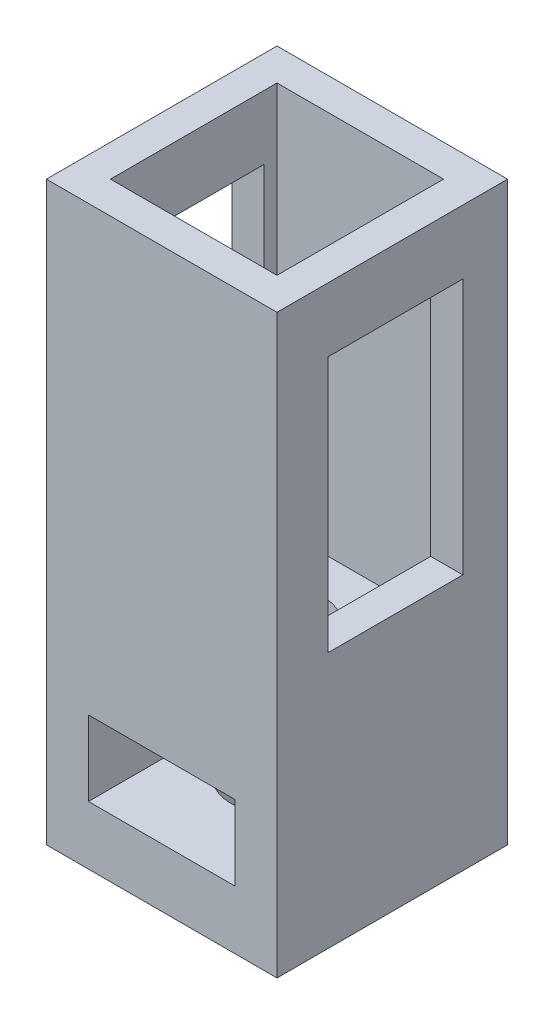
ISO-10303-21;
HEADER;
FILE_DESCRIPTION(('STEP AP214'),'2;1');
FILE_NAME('part.step','',(''),(''),'','','');
FILE_SCHEMA(('AUTOMOTIVE_DESIGN { 1 0 10303 214 1 1 1 1 }'));
ENDSEC;
DATA;
#1=APPLICATION_CONTEXT('core data for automotive mechanical design processes');
#2=APPLICATION_PROTOCOL_DEFINITION('international standard','automotive_design',2000,#1);
#3=PRODUCT_CONTEXT('',#1,'mechanical');
#4=PRODUCT('Part','Part','',(#3));
#5=PRODUCT_RELATED_PRODUCT_CATEGORY('part','',(#4));
#6=PRODUCT_DEFINITION_FORMATION('','',#4);
#7=PRODUCT_DEFINITION_CONTEXT('part definition',#1,'design');
#8=PRODUCT_DEFINITION('design','',#6,#7);
#9=PRODUCT_DEFINITION_SHAPE('','',#8);
#10=(LENGTH_UNIT() NAMED_UNIT(*) SI_UNIT(.MILLI.,.METRE.));
#11=(NAMED_UNIT(*) PLANE_ANGLE_UNIT() SI_UNIT($,.RADIAN.));
#12=(NAMED_UNIT(*) SI_UNIT($,.STERADIAN.) SOLID_ANGLE_UNIT());
#13=UNCERTAINTY_MEASURE_WITH_UNIT(LENGTH_MEASURE(1.E-05),#10,'distance_accuracy_value','');
#14=(GEOMETRIC_REPRESENTATION_CONTEXT(3) GLOBAL_UNCERTAINTY_ASSIGNED_CONTEXT((#13)) GLOBAL_UNIT_ASSIGNED_CONTEXT((#10,
#11,#12)) REPRESENTATION_CONTEXT('',''));
#15=CARTESIAN_POINT('',(0.,0.,0.));
#16=DIRECTION('',(0.,0.,1.));
#17=DIRECTION('',(1.,0.,0.));
#18=AXIS2_PLACEMENT_3D('',#15,#16,#17);
#19=CARTESIAN_POINT('',(0.,35.,0.));
#20=DIRECTION('',(1.,0.,0.));
#21=DIRECTION('',(0.,0.,-1.));
#22=AXIS2_PLACEMENT_3D('',#19,#20,#21);
#23=PLANE('',#22);
#24=DIRECTION('',(0.,0.,1.));
#25=VECTOR('',#24,1.);
#26=CARTESIAN_POINT('',(0.,30.,-4.));
#27=LINE('',#26,#25);
#28=CARTESIAN_POINT('',(0.,30.,-14.5));
#29=VERTEX_POINT('',#28);
#30=CARTESIAN_POINT('',(0.,30.,-4.));
#31=VERTEX_POINT('',#30);
#32=EDGE_CURVE('E234',#29,#31,#27,.T.);
#33=ORIENTED_EDGE('',*,*,#32,.T.);
#34=DIRECTION('',(0.,-1.,0.));
#35=VECTOR('',#34,1.);
#36=CARTESIAN_POINT('',(0.,30.,-4.));
#37=LINE('',#36,#35);
#38=CARTESIAN_POINT('',(0.,10.,-4.));
#39=VERTEX_POINT('',#38);
#40=EDGE_CURVE('E224',#31,#39,#37,.T.);
#41=ORIENTED_EDGE('',*,*,#40,.T.);
#42=DIRECTION('',(0.,0.,-1.));
#43=VECTOR('',#42,1.);
#44=CARTESIAN_POINT('',(0.,10.,-4.));
#45=LINE('',#44,#43);
#46=CARTESIAN_POINT('',(0.,10.,-14.5));
#47=VERTEX_POINT('',#46);
#48=EDGE_CURVE('E227',#39,#47,#45,.T.);
#49=ORIENTED_EDGE('',*,*,#48,.T.);
#50=DIRECTION('',(0.,1.,0.));
#51=VECTOR('',#50,1.);
#52=CARTESIAN_POINT('',(0.,30.,-14.5));
#53=LINE('',#52,#51);
#54=EDGE_CURVE('E231',#47,#29,#53,.T.);
#55=ORIENTED_EDGE('',*,*,#54,.T.);
#56=EDGE_LOOP('',(#33,#41,#49,#55));
#57=FACE_BOUND('',#56,.T.);
#58=DIRECTION('',(0.,-1.,0.));
#59=VECTOR('',#58,1.);
#60=CARTESIAN_POINT('',(0.,35.,-18.));
#61=LINE('',#60,#59);
#62=CARTESIAN_POINT('',(0.,35.,-18.));
#63=VERTEX_POINT('',#62);
#64=CARTESIAN_POINT('',(0.,-10.,-18.));
#65=VERTEX_POINT('',#64);
#66=EDGE_CURVE('E314',#63,#65,#61,.T.);
#67=ORIENTED_EDGE('',*,*,#66,.T.);
#68=DIRECTION('',(0.,0.,-1.));
#69=VECTOR('',#68,1.);
#70=CARTESIAN_POINT('',(0.,-10.,0.));
#71=LINE('',#70,#69);
#72=CARTESIAN_POINT('',(0.,-10.,0.));
#73=VERTEX_POINT('',#72);
#74=EDGE_CURVE('E208',#73,#65,#71,.T.);
#75=ORIENTED_EDGE('',*,*,#74,.F.);
#76=DIRECTION('',(0.,-1.,0.));
#77=VECTOR('',#76,1.);
#78=CARTESIAN_POINT('',(0.,35.,0.));
#79=LINE('',#78,#77);
#80=CARTESIAN_POINT('',(0.,35.,0.));
#81=VERTEX_POINT('',#80);
#82=EDGE_CURVE('E320',#81,#73,#79,.T.);
#83=ORIENTED_EDGE('',*,*,#82,.F.);
#84=DIRECTION('',(0.,0.,1.));
#85=VECTOR('',#84,1.);
#86=CARTESIAN_POINT('',(0.,35.,0.));
#87=LINE('',#86,#85);
#88=EDGE_CURVE('E299',#63,#81,#87,.T.);
#89=ORIENTED_EDGE('',*,*,#88,.F.);
#90=EDGE_LOOP('',(#67,#75,#83,#89));
#91=FACE_BOUND('',#90,.T.);
#92=ADVANCED_FACE('F35',(#57,#91),#23,.F.);
#93=CARTESIAN_POINT('',(0.,35.,0.));
#94=DIRECTION('',(0.,0.,-1.));
#95=DIRECTION('',(-1.,0.,0.));
#96=AXIS2_PLACEMENT_3D('',#93,#94,#95);
#97=PLANE('',#96);
#98=DIRECTION('',(1.,0.,0.));
#99=VECTOR('',#98,1.);
#100=CARTESIAN_POINT('',(3.285,-5.425,0.));
#101=LINE('',#100,#99);
#102=CARTESIAN_POINT('',(3.285,-5.425,0.));
#103=VERTEX_POINT('',#102);
#104=CARTESIAN_POINT('',(14.715,-5.425,0.));
#105=VERTEX_POINT('',#104);
#106=EDGE_CURVE('E202',#103,#105,#101,.T.);
#107=ORIENTED_EDGE('',*,*,#106,.F.);
#108=DIRECTION('',(0.,-1.,0.));
#109=VECTOR('',#108,1.);
#110=CARTESIAN_POINT('',(3.285,0.424999999999999,0.));
#111=LINE('',#110,#109);
#112=CARTESIAN_POINT('',(3.285,0.424999999999999,0.));
#113=VERTEX_POINT('',#112);
#114=EDGE_CURVE('E50',#113,#103,#111,.T.);
#115=ORIENTED_EDGE('',*,*,#114,.F.);
#116=DIRECTION('',(-1.,0.,0.));
#117=VECTOR('',#116,1.);
#118=CARTESIAN_POINT('',(3.285,0.424999999999999,0.));
#119=LINE('',#118,#117);
#120=CARTESIAN_POINT('',(14.715,0.424999999999999,0.));
#121=VERTEX_POINT('',#120);
#122=EDGE_CURVE('E190',#121,#113,#119,.T.);
#123=ORIENTED_EDGE('',*,*,#122,.F.);
#124=DIRECTION('',(0.,1.,0.));
#125=VECTOR('',#124,1.);
#126=CARTESIAN_POINT('',(14.715,0.424999999999999,0.));
#127=LINE('',#126,#125);
#128=EDGE_CURVE('E193',#105,#121,#127,.T.);
#129=ORIENTED_EDGE('',*,*,#128,.F.);
#130=EDGE_LOOP('',(#107,#115,#123,#129));
#131=FACE_BOUND('',#130,.T.);
#132=ORIENTED_EDGE('',*,*,#82,.T.);
#133=DIRECTION('',(-1.,0.,0.));
#134=VECTOR('',#133,1.);
#135=CARTESIAN_POINT('',(0.,-10.,0.));
#136=LINE('',#135,#134);
#137=CARTESIAN_POINT('',(18.,-10.,0.));
#138=VERTEX_POINT('',#137);
#139=EDGE_CURVE('E220',#138,#73,#136,.T.);
#140=ORIENTED_EDGE('',*,*,#139,.F.);
#141=DIRECTION('',(0.,-1.,0.));
#142=VECTOR('',#141,1.);
#143=CARTESIAN_POINT('',(18.,35.,0.));
#144=LINE('',#143,#142);
#145=CARTESIAN_POINT('',(18.,35.,0.));
#146=VERTEX_POINT('',#145);
#147=EDGE_CURVE('E318',#146,#138,#144,.T.);
#148=ORIENTED_EDGE('',*,*,#147,.F.);
#149=DIRECTION('',(1.,0.,0.));
#150=VECTOR('',#149,1.);
#151=CARTESIAN_POINT('',(0.,35.,0.));
#152=LINE('',#151,#150);
#153=EDGE_CURVE('E308',#81,#146,#152,.T.);
#154=ORIENTED_EDGE('',*,*,#153,.F.);
#155=EDGE_LOOP('',(#132,#140,#148,#154));
#156=FACE_BOUND('',#155,.T.);
#157=ADVANCED_FACE('F371',(#131,#156),#97,.F.);
#158=CARTESIAN_POINT('',(18.,35.,0.));
#159=DIRECTION('',(-1.,0.,0.));
#160=DIRECTION('',(0.,0.,1.));
#161=AXIS2_PLACEMENT_3D('',#158,#159,#160);
#162=PLANE('',#161);
#163=DIRECTION('',(0.,0.,-1.));
#164=VECTOR('',#163,1.);
#165=CARTESIAN_POINT('',(18.,10.,-4.));
#166=LINE('',#165,#164);
#167=CARTESIAN_POINT('',(18.,10.,-4.));
#168=VERTEX_POINT('',#167);
#169=CARTESIAN_POINT('',(18.,10.,-14.5));
#170=VERTEX_POINT('',#169);
#171=EDGE_CURVE('E239',#168,#170,#166,.T.);
#172=ORIENTED_EDGE('',*,*,#171,.F.);
#173=DIRECTION('',(0.,-1.,0.));
#174=VECTOR('',#173,1.);
#175=CARTESIAN_POINT('',(18.,30.,-4.));
#176=LINE('',#175,#174);
#177=CARTESIAN_POINT('',(18.,30.,-4.));
#178=VERTEX_POINT('',#177);
#179=EDGE_CURVE('E223',#178,#168,#176,.T.);
#180=ORIENTED_EDGE('',*,*,#179,.F.);
#181=DIRECTION('',(0.,0.,1.));
#182=VECTOR('',#181,1.);
#183=CARTESIAN_POINT('',(18.,30.,-4.));
#184=LINE('',#183,#182);
#185=CARTESIAN_POINT('',(18.,30.,-14.5));
#186=VERTEX_POINT('',#185);
#187=EDGE_CURVE('E228',#186,#178,#184,.T.);
#188=ORIENTED_EDGE('',*,*,#187,.F.);
#189=DIRECTION('',(0.,1.,0.));
#190=VECTOR('',#189,1.);
#191=CARTESIAN_POINT('',(18.,30.,-14.5));
#192=LINE('',#191,#190);
#193=EDGE_CURVE('E242',#170,#186,#192,.T.);
#194=ORIENTED_EDGE('',*,*,#193,.F.);
#195=EDGE_LOOP('',(#172,#180,#188,#194));
#196=FACE_BOUND('',#195,.T.);
#197=ORIENTED_EDGE('',*,*,#147,.T.);
#198=DIRECTION('',(0.,0.,1.));
#199=VECTOR('',#198,1.);
#200=CARTESIAN_POINT('',(18.,-10.,0.));
#201=LINE('',#200,#199);
#202=CARTESIAN_POINT('',(18.,-10.,-18.));
#203=VERTEX_POINT('',#202);
#204=EDGE_CURVE('E217',#203,#138,#201,.T.);
#205=ORIENTED_EDGE('',*,*,#204,.F.);
#206=DIRECTION('',(0.,-1.,0.));
#207=VECTOR('',#206,1.);
#208=CARTESIAN_POINT('',(18.,35.,-18.));
#209=LINE('',#208,#207);
#210=CARTESIAN_POINT('',(18.,35.,-18.));
#211=VERTEX_POINT('',#210);
#212=EDGE_CURVE('E316',#211,#203,#209,.T.);
#213=ORIENTED_EDGE('',*,*,#212,.F.);
#214=DIRECTION('',(0.,0.,-1.));
#215=VECTOR('',#214,1.);
#216=CARTESIAN_POINT('',(18.,35.,0.));
#217=LINE('',#216,#215);
#218=EDGE_CURVE('E310',#146,#211,#217,.T.);
#219=ORIENTED_EDGE('',*,*,#218,.F.);
#220=EDGE_LOOP('',(#197,#205,#213,#219));
#221=FACE_BOUND('',#220,.T.);
#222=ADVANCED_FACE('F344',(#196,#221),#162,.F.);
#223=CARTESIAN_POINT('',(0.,35.,-18.));
#224=DIRECTION('',(0.,0.,1.));
#225=DIRECTION('',(1.,0.,0.));
#226=AXIS2_PLACEMENT_3D('',#223,#224,#225);
#227=PLANE('',#226);
#228=DIRECTION('',(-1.,0.,0.));
#229=VECTOR('',#228,1.);
#230=CARTESIAN_POINT('',(3.285,0.424999999999999,-18.));
#231=LINE('',#230,#229);
#232=CARTESIAN_POINT('',(14.715,0.424999999999999,-18.));
#233=VERTEX_POINT('',#232);
#234=CARTESIAN_POINT('',(3.285,0.424999999999999,-18.));
#235=VERTEX_POINT('',#234);
#236=EDGE_CURVE('E180',#233,#235,#231,.T.);
#237=ORIENTED_EDGE('',*,*,#236,.T.);
#238=DIRECTION('',(0.,-1.,0.));
#239=VECTOR('',#238,1.);
#240=CARTESIAN_POINT('',(3.285,0.424999999999999,-18.));
#241=LINE('',#240,#239);
#242=CARTESIAN_POINT('',(3.285,-5.425,-18.));
#243=VERTEX_POINT('',#242);
#244=EDGE_CURVE('E174',#235,#243,#241,.T.);
#245=ORIENTED_EDGE('',*,*,#244,.T.);
#246=DIRECTION('',(1.,0.,0.));
#247=VECTOR('',#246,1.);
#248=CARTESIAN_POINT('',(3.285,-5.425,-18.));
#249=LINE('',#248,#247);
#250=CARTESIAN_POINT('',(14.715,-5.425,-18.));
#251=VERTEX_POINT('',#250);
#252=EDGE_CURVE('E183',#243,#251,#249,.T.);
#253=ORIENTED_EDGE('',*,*,#252,.T.);
#254=DIRECTION('',(0.,1.,0.));
#255=VECTOR('',#254,1.);
#256=CARTESIAN_POINT('',(14.715,0.424999999999999,-18.));
#257=LINE('',#256,#255);
#258=EDGE_CURVE('E58',#251,#233,#257,.T.);
#259=ORIENTED_EDGE('',*,*,#258,.T.);
#260=EDGE_LOOP('',(#237,#245,#253,#259));
#261=FACE_BOUND('',#260,.T.);
#262=ORIENTED_EDGE('',*,*,#212,.T.);
#263=DIRECTION('',(1.,0.,0.));
#264=VECTOR('',#263,1.);
#265=CARTESIAN_POINT('',(0.,-10.,-18.));
#266=LINE('',#265,#264);
#267=EDGE_CURVE('E214',#65,#203,#266,.T.);
#268=ORIENTED_EDGE('',*,*,#267,.F.);
#269=ORIENTED_EDGE('',*,*,#66,.F.);
#270=DIRECTION('',(-1.,0.,0.));
#271=VECTOR('',#270,1.);
#272=CARTESIAN_POINT('',(0.,35.,-18.));
#273=LINE('',#272,#271);
#274=EDGE_CURVE('E312',#211,#63,#273,.T.);
#275=ORIENTED_EDGE('',*,*,#274,.F.);
#276=EDGE_LOOP('',(#262,#268,#269,#275));
#277=FACE_BOUND('',#276,.T.);
#278=ADVANCED_FACE('F187',(#261,#277),#227,.F.);
#279=CARTESIAN_POINT('',(0.,35.,0.));
#280=DIRECTION('',(0.,-1.,0.));
#281=DIRECTION('',(0.,0.,-1.));
#282=AXIS2_PLACEMENT_3D('',#279,#280,#281);
#283=PLANE('',#282);
#284=DIRECTION('',(1.,0.,0.));
#285=VECTOR('',#284,1.);
#286=CARTESIAN_POINT('',(2.5,35.,-2.5));
#287=LINE('',#286,#285);
#288=CARTESIAN_POINT('',(2.5,35.,-2.5));
#289=VERTEX_POINT('',#288);
#290=CARTESIAN_POINT('',(15.5,35.,-2.5));
#291=VERTEX_POINT('',#290);
#292=EDGE_CURVE('E289',#289,#291,#287,.T.);
#293=ORIENTED_EDGE('',*,*,#292,.F.);
#294=DIRECTION('',(0.,0.,1.));
#295=VECTOR('',#294,1.);
#296=CARTESIAN_POINT('',(2.5,35.,-15.5));
#297=LINE('',#296,#295);
#298=CARTESIAN_POINT('',(2.5,35.,-15.5));
#299=VERTEX_POINT('',#298);
#300=EDGE_CURVE('E273',#299,#289,#297,.T.);
#301=ORIENTED_EDGE('',*,*,#300,.F.);
#302=DIRECTION('',(-1.,0.,0.));
#303=VECTOR('',#302,1.);
#304=CARTESIAN_POINT('',(2.5,35.,-15.5));
#305=LINE('',#304,#303);
#306=CARTESIAN_POINT('',(15.5,35.,-15.5));
#307=VERTEX_POINT('',#306);
#308=EDGE_CURVE('E278',#307,#299,#305,.T.);
#309=ORIENTED_EDGE('',*,*,#308,.F.);
#310=DIRECTION('',(0.,0.,-1.));
#311=VECTOR('',#310,1.);
#312=CARTESIAN_POINT('',(15.5,35.,-15.5));
#313=LINE('',#312,#311);
#314=EDGE_CURVE('E292',#291,#307,#313,.T.);
#315=ORIENTED_EDGE('',*,*,#314,.F.);
#316=EDGE_LOOP('',(#293,#301,#309,#315));
#317=FACE_BOUND('',#316,.T.);
#318=ORIENTED_EDGE('',*,*,#88,.T.);
#319=ORIENTED_EDGE('',*,*,#153,.T.);
#320=ORIENTED_EDGE('',*,*,#218,.T.);
#321=ORIENTED_EDGE('',*,*,#274,.T.);
#322=EDGE_LOOP('',(#318,#319,#320,#321));
#323=FACE_BOUND('',#322,.T.);
#324=ADVANCED_FACE('F393',(#317,#323),#283,.F.);
#325=CARTESIAN_POINT('',(2.5,5.,-15.5));
#326=DIRECTION('',(-1.,0.,0.));
#327=DIRECTION('',(0.,0.,1.));
#328=AXIS2_PLACEMENT_3D('',#325,#326,#327);
#329=PLANE('',#328);
#330=DIRECTION('',(0.,0.,1.));
#331=VECTOR('',#330,1.);
#332=CARTESIAN_POINT('',(2.5,10.,-15.5));
#333=LINE('',#332,#331);
#334=CARTESIAN_POINT('',(2.5,10.,-14.5));
#335=VERTEX_POINT('',#334);
#336=CARTESIAN_POINT('',(2.5,10.,-4.));
#337=VERTEX_POINT('',#336);
#338=EDGE_CURVE('E250',#335,#337,#333,.T.);
#339=ORIENTED_EDGE('',*,*,#338,.T.);
#340=DIRECTION('',(0.,1.,0.));
#341=VECTOR('',#340,1.);
#342=CARTESIAN_POINT('',(2.5,5.,-4.));
#343=LINE('',#342,#341);
#344=CARTESIAN_POINT('',(2.5,30.,-4.));
#345=VERTEX_POINT('',#344);
#346=EDGE_CURVE('E270',#337,#345,#343,.T.);
#347=ORIENTED_EDGE('',*,*,#346,.T.);
#348=DIRECTION('',(0.,0.,-1.));
#349=VECTOR('',#348,1.);
#350=CARTESIAN_POINT('',(2.5,30.,-15.5));
#351=LINE('',#350,#349);
#352=CARTESIAN_POINT('',(2.5,30.,-14.5));
#353=VERTEX_POINT('',#352);
#354=EDGE_CURVE('E267',#345,#353,#351,.T.);
#355=ORIENTED_EDGE('',*,*,#354,.T.);
#356=DIRECTION('',(0.,-1.,0.));
#357=VECTOR('',#356,1.);
#358=CARTESIAN_POINT('',(2.5,5.,-14.5));
#359=LINE('',#358,#357);
#360=EDGE_CURVE('E264',#353,#335,#359,.T.);
#361=ORIENTED_EDGE('',*,*,#360,.T.);
#362=EDGE_LOOP('',(#339,#347,#355,#361));
#363=FACE_BOUND('',#362,.T.);
#364=ORIENTED_EDGE('',*,*,#300,.T.);
#365=DIRECTION('',(0.,1.,0.));
#366=VECTOR('',#365,1.);
#367=CARTESIAN_POINT('',(2.5,5.,-2.5));
#368=LINE('',#367,#366);
#369=CARTESIAN_POINT('',(2.5,5.,-2.5));
#370=VERTEX_POINT('',#369);
#371=EDGE_CURVE('E287',#370,#289,#368,.T.);
#372=ORIENTED_EDGE('',*,*,#371,.F.);
#373=DIRECTION('',(0.,0.,1.));
#374=VECTOR('',#373,1.);
#375=CARTESIAN_POINT('',(2.5,5.,-15.5));
#376=LINE('',#375,#374);
#377=CARTESIAN_POINT('',(2.5,5.,-15.5));
#378=VERTEX_POINT('',#377);
#379=EDGE_CURVE('E274',#378,#370,#376,.T.);
#380=ORIENTED_EDGE('',*,*,#379,.F.);
#381=DIRECTION('',(0.,1.,0.));
#382=VECTOR('',#381,1.);
#383=CARTESIAN_POINT('',(2.5,5.,-15.5));
#384=LINE('',#383,#382);
#385=EDGE_CURVE('E297',#378,#299,#384,.T.);
#386=ORIENTED_EDGE('',*,*,#385,.T.);
#387=EDGE_LOOP('',(#364,#372,#380,#386));
#388=FACE_BOUND('',#387,.T.);
#389=ADVANCED_FACE('F403',(#363,#388),#329,.F.);
#390=CARTESIAN_POINT('',(2.5,5.,-15.5));
#391=DIRECTION('',(0.,0.,-1.));
#392=DIRECTION('',(-1.,0.,0.));
#393=AXIS2_PLACEMENT_3D('',#390,#391,#392);
#394=PLANE('',#393);
#395=ORIENTED_EDGE('',*,*,#308,.T.);
#396=ORIENTED_EDGE('',*,*,#385,.F.);
#397=DIRECTION('',(-1.,0.,0.));
#398=VECTOR('',#397,1.);
#399=CARTESIAN_POINT('',(2.5,5.,-15.5));
#400=LINE('',#399,#398);
#401=CARTESIAN_POINT('',(15.5,5.,-15.5));
#402=VERTEX_POINT('',#401);
#403=EDGE_CURVE('E284',#402,#378,#400,.T.);
#404=ORIENTED_EDGE('',*,*,#403,.F.);
#405=DIRECTION('',(0.,1.,0.));
#406=VECTOR('',#405,1.);
#407=CARTESIAN_POINT('',(15.5,5.,-15.5));
#408=LINE('',#407,#406);
#409=EDGE_CURVE('E300',#402,#307,#408,.T.);
#410=ORIENTED_EDGE('',*,*,#409,.T.);
#411=EDGE_LOOP('',(#395,#396,#404,#410));
#412=FACE_BOUND('',#411,.T.);
#413=ADVANCED_FACE('F407',(#412),#394,.F.);
#414=CARTESIAN_POINT('',(15.5,5.,-15.5));
#415=DIRECTION('',(1.,0.,0.));
#416=DIRECTION('',(0.,0.,-1.));
#417=AXIS2_PLACEMENT_3D('',#414,#415,#416);
#418=PLANE('',#417);
#419=DIRECTION('',(0.,0.,1.));
#420=VECTOR('',#419,1.);
#421=CARTESIAN_POINT('',(15.5,30.,-15.5));
#422=LINE('',#421,#420);
#423=CARTESIAN_POINT('',(15.5,30.,-14.5));
#424=VERTEX_POINT('',#423);
#425=CARTESIAN_POINT('',(15.5,30.,-4.));
#426=VERTEX_POINT('',#425);
#427=EDGE_CURVE('E43',#424,#426,#422,.T.);
#428=ORIENTED_EDGE('',*,*,#427,.T.);
#429=DIRECTION('',(0.,-1.,0.));
#430=VECTOR('',#429,1.);
#431=CARTESIAN_POINT('',(15.5,5.,-4.));
#432=LINE('',#431,#430);
#433=CARTESIAN_POINT('',(15.5,10.,-4.));
#434=VERTEX_POINT('',#433);
#435=EDGE_CURVE('E11',#426,#434,#432,.T.);
#436=ORIENTED_EDGE('',*,*,#435,.T.);
#437=DIRECTION('',(0.,0.,-1.));
#438=VECTOR('',#437,1.);
#439=CARTESIAN_POINT('',(15.5,10.,-15.5));
#440=LINE('',#439,#438);
#441=CARTESIAN_POINT('',(15.5,10.,-14.5));
#442=VERTEX_POINT('',#441);
#443=EDGE_CURVE('E322',#434,#442,#440,.T.);
#444=ORIENTED_EDGE('',*,*,#443,.T.);
#445=DIRECTION('',(0.,1.,0.));
#446=VECTOR('',#445,1.);
#447=CARTESIAN_POINT('',(15.5,5.,-14.5));
#448=LINE('',#447,#446);
#449=EDGE_CURVE('E325',#442,#424,#448,.T.);
#450=ORIENTED_EDGE('',*,*,#449,.T.);
#451=EDGE_LOOP('',(#428,#436,#444,#450));
#452=FACE_BOUND('',#451,.T.);
#453=ORIENTED_EDGE('',*,*,#314,.T.);
#454=ORIENTED_EDGE('',*,*,#409,.F.);
#455=DIRECTION('',(0.,0.,-1.));
#456=VECTOR('',#455,1.);
#457=CARTESIAN_POINT('',(15.5,5.,-15.5));
#458=LINE('',#457,#456);
#459=CARTESIAN_POINT('',(15.5,5.,-2.5));
#460=VERTEX_POINT('',#459);
#461=EDGE_CURVE('E281',#460,#402,#458,.T.);
#462=ORIENTED_EDGE('',*,*,#461,.F.);
#463=DIRECTION('',(0.,1.,0.));
#464=VECTOR('',#463,1.);
#465=CARTESIAN_POINT('',(15.5,5.,-2.5));
#466=LINE('',#465,#464);
#467=EDGE_CURVE('E302',#460,#291,#466,.T.);
#468=ORIENTED_EDGE('',*,*,#467,.T.);
#469=EDGE_LOOP('',(#453,#454,#462,#468));
#470=FACE_BOUND('',#469,.T.);
#471=ADVANCED_FACE('F330',(#452,#470),#418,.F.);
#472=CARTESIAN_POINT('',(2.5,5.,-2.5));
#473=DIRECTION('',(0.,0.,1.));
#474=DIRECTION('',(1.,0.,0.));
#475=AXIS2_PLACEMENT_3D('',#472,#473,#474);
#476=PLANE('',#475);
#477=ORIENTED_EDGE('',*,*,#292,.T.);
#478=ORIENTED_EDGE('',*,*,#467,.F.);
#479=DIRECTION('',(1.,0.,0.));
#480=VECTOR('',#479,1.);
#481=CARTESIAN_POINT('',(2.5,5.,-2.5));
#482=LINE('',#481,#480);
#483=EDGE_CURVE('E277',#370,#460,#482,.T.);
#484=ORIENTED_EDGE('',*,*,#483,.F.);
#485=ORIENTED_EDGE('',*,*,#371,.T.);
#486=EDGE_LOOP('',(#477,#478,#484,#485));
#487=FACE_BOUND('',#486,.T.);
#488=ADVANCED_FACE('F363',(#487),#476,.F.);
#489=CARTESIAN_POINT('',(0.,5.,0.));
#490=DIRECTION('',(0.,1.,0.));
#491=DIRECTION('',(0.,0.,1.));
#492=AXIS2_PLACEMENT_3D('',#489,#490,#491);
#493=PLANE('',#492);
#494=CARTESIAN_POINT('',(9.,5.,-9.));
#495=DIRECTION('',(0.,-1.,0.));
#496=DIRECTION('',(0.,0.,-1.));
#497=AXIS2_PLACEMENT_3D('',#494,#495,#496);
#498=CIRCLE('',#497,3.57123999999999);
#499=CARTESIAN_POINT('',(9.,5.,-12.57124));
#500=VERTEX_POINT('',#499);
#501=EDGE_CURVE('E472',#500,#500,#498,.T.);
#502=ORIENTED_EDGE('',*,*,#501,.T.);
#503=EDGE_LOOP('',(#502));
#504=FACE_BOUND('',#503,.T.);
#505=ORIENTED_EDGE('',*,*,#379,.T.);
#506=ORIENTED_EDGE('',*,*,#483,.T.);
#507=ORIENTED_EDGE('',*,*,#461,.T.);
#508=ORIENTED_EDGE('',*,*,#403,.T.);
#509=EDGE_LOOP('',(#505,#506,#507,#508));
#510=FACE_BOUND('',#509,.T.);
#511=ADVANCED_FACE('F353',(#504,#510),#493,.T.);
#512=CARTESIAN_POINT('',(0.,10.,-4.));
#513=DIRECTION('',(0.,-1.,0.));
#514=DIRECTION('',(0.,0.,-1.));
#515=AXIS2_PLACEMENT_3D('',#512,#513,#514);
#516=PLANE('',#515);
#517=DIRECTION('',(1.,0.,0.));
#518=VECTOR('',#517,1.);
#519=CARTESIAN_POINT('',(0.,10.,-4.));
#520=LINE('',#519,#518);
#521=EDGE_CURVE('E237',#434,#168,#520,.T.);
#522=ORIENTED_EDGE('',*,*,#521,.T.);
#523=ORIENTED_EDGE('',*,*,#171,.T.);
#524=DIRECTION('',(1.,0.,0.));
#525=VECTOR('',#524,1.);
#526=CARTESIAN_POINT('',(0.,10.,-14.5));
#527=LINE('',#526,#525);
#528=EDGE_CURVE('E259',#442,#170,#527,.T.);
#529=ORIENTED_EDGE('',*,*,#528,.F.);
#530=ORIENTED_EDGE('',*,*,#443,.F.);
#531=EDGE_LOOP('',(#522,#523,#529,#530));
#532=FACE_BOUND('',#531,.T.);
#533=ADVANCED_FACE('F351',(#532),#516,.F.);
#534=CARTESIAN_POINT('',(0.,30.,-14.5));
#535=DIRECTION('',(0.,0.,-1.));
#536=DIRECTION('',(-1.,0.,0.));
#537=AXIS2_PLACEMENT_3D('',#534,#535,#536);
#538=PLANE('',#537);
#539=ORIENTED_EDGE('',*,*,#528,.T.);
#540=ORIENTED_EDGE('',*,*,#193,.T.);
#541=DIRECTION('',(1.,0.,0.));
#542=VECTOR('',#541,1.);
#543=CARTESIAN_POINT('',(0.,30.,-14.5));
#544=LINE('',#543,#542);
#545=EDGE_CURVE('E255',#424,#186,#544,.T.);
#546=ORIENTED_EDGE('',*,*,#545,.F.);
#547=ORIENTED_EDGE('',*,*,#449,.F.);
#548=EDGE_LOOP('',(#539,#540,#546,#547));
#549=FACE_BOUND('',#548,.T.);
#550=ADVANCED_FACE('F338',(#549),#538,.F.);
#551=CARTESIAN_POINT('',(0.,30.,-4.));
#552=DIRECTION('',(0.,1.,0.));
#553=DIRECTION('',(0.,0.,1.));
#554=AXIS2_PLACEMENT_3D('',#551,#552,#553);
#555=PLANE('',#554);
#556=ORIENTED_EDGE('',*,*,#545,.T.);
#557=ORIENTED_EDGE('',*,*,#187,.T.);
#558=DIRECTION('',(1.,0.,0.));
#559=VECTOR('',#558,1.);
#560=CARTESIAN_POINT('',(0.,30.,-4.));
#561=LINE('',#560,#559);
#562=EDGE_CURVE('E251',#426,#178,#561,.T.);
#563=ORIENTED_EDGE('',*,*,#562,.F.);
#564=ORIENTED_EDGE('',*,*,#427,.F.);
#565=EDGE_LOOP('',(#556,#557,#563,#564));
#566=FACE_BOUND('',#565,.T.);
#567=ADVANCED_FACE('F336',(#566),#555,.F.);
#568=CARTESIAN_POINT('',(0.,30.,-4.));
#569=DIRECTION('',(0.,0.,1.));
#570=DIRECTION('',(1.,0.,0.));
#571=AXIS2_PLACEMENT_3D('',#568,#569,#570);
#572=PLANE('',#571);
#573=ORIENTED_EDGE('',*,*,#562,.T.);
#574=ORIENTED_EDGE('',*,*,#179,.T.);
#575=ORIENTED_EDGE('',*,*,#521,.F.);
#576=ORIENTED_EDGE('',*,*,#435,.F.);
#577=EDGE_LOOP('',(#573,#574,#575,#576));
#578=FACE_BOUND('',#577,.T.);
#579=ADVANCED_FACE('F349',(#578),#572,.F.);
#580=EDGE_CURVE('E260',#39,#337,#520,.T.);
#581=ORIENTED_EDGE('',*,*,#580,.F.);
#582=ORIENTED_EDGE('',*,*,#40,.F.);
#583=EDGE_CURVE('E247',#31,#345,#561,.T.);
#584=ORIENTED_EDGE('',*,*,#583,.T.);
#585=ORIENTED_EDGE('',*,*,#346,.F.);
#586=EDGE_LOOP('',(#581,#582,#584,#585));
#587=FACE_BOUND('',#586,.T.);
#588=ADVANCED_FACE('F416',(#587),#572,.F.);
#589=ORIENTED_EDGE('',*,*,#583,.F.);
#590=ORIENTED_EDGE('',*,*,#32,.F.);
#591=EDGE_CURVE('E252',#29,#353,#544,.T.);
#592=ORIENTED_EDGE('',*,*,#591,.T.);
#593=ORIENTED_EDGE('',*,*,#354,.F.);
#594=EDGE_LOOP('',(#589,#590,#592,#593));
#595=FACE_BOUND('',#594,.T.);
#596=ADVANCED_FACE('F418',(#595),#555,.F.);
#597=ORIENTED_EDGE('',*,*,#591,.F.);
#598=ORIENTED_EDGE('',*,*,#54,.F.);
#599=EDGE_CURVE('E256',#47,#335,#527,.T.);
#600=ORIENTED_EDGE('',*,*,#599,.T.);
#601=ORIENTED_EDGE('',*,*,#360,.F.);
#602=EDGE_LOOP('',(#597,#598,#600,#601));
#603=FACE_BOUND('',#602,.T.);
#604=ADVANCED_FACE('F361',(#603),#538,.F.);
#605=ORIENTED_EDGE('',*,*,#599,.F.);
#606=ORIENTED_EDGE('',*,*,#48,.F.);
#607=ORIENTED_EDGE('',*,*,#580,.T.);
#608=ORIENTED_EDGE('',*,*,#338,.F.);
#609=EDGE_LOOP('',(#605,#606,#607,#608));
#610=FACE_BOUND('',#609,.T.);
#611=ADVANCED_FACE('F355',(#610),#516,.F.);
#612=CARTESIAN_POINT('',(0.,-10.,0.));
#613=DIRECTION('',(0.,-1.,0.));
#614=DIRECTION('',(0.,0.,-1.));
#615=AXIS2_PLACEMENT_3D('',#612,#613,#614);
#616=PLANE('',#615);
#617=CARTESIAN_POINT('',(9.,-10.,-9.));
#618=DIRECTION('',(0.,-1.,0.));
#619=DIRECTION('',(0.,0.,-1.));
#620=AXIS2_PLACEMENT_3D('',#617,#618,#619);
#621=CIRCLE('',#620,3.57124);
#622=CARTESIAN_POINT('',(9.,-10.,-12.57124));
#623=VERTEX_POINT('',#622);
#624=EDGE_CURVE('E477',#623,#623,#621,.T.);
#625=ORIENTED_EDGE('',*,*,#624,.F.);
#626=EDGE_LOOP('',(#625));
#627=FACE_BOUND('',#626,.T.);
#628=ORIENTED_EDGE('',*,*,#74,.T.);
#629=ORIENTED_EDGE('',*,*,#267,.T.);
#630=ORIENTED_EDGE('',*,*,#204,.T.);
#631=ORIENTED_EDGE('',*,*,#139,.T.);
#632=EDGE_LOOP('',(#628,#629,#630,#631));
#633=FACE_BOUND('',#632,.T.);
#634=ADVANCED_FACE('F368',(#627,#633),#616,.T.);
#635=CARTESIAN_POINT('',(3.285,0.424999999999999,-18.));
#636=DIRECTION('',(-1.,0.,0.));
#637=DIRECTION('',(0.,-1.,0.));
#638=AXIS2_PLACEMENT_3D('',#635,#636,#637);
#639=PLANE('',#638);
#640=ORIENTED_EDGE('',*,*,#114,.T.);
#641=DIRECTION('',(0.,0.,1.));
#642=VECTOR('',#641,1.);
#643=CARTESIAN_POINT('',(3.285,-5.425,-18.));
#644=LINE('',#643,#642);
#645=EDGE_CURVE('E170',#243,#103,#644,.T.);
#646=ORIENTED_EDGE('',*,*,#645,.F.);
#647=ORIENTED_EDGE('',*,*,#244,.F.);
#648=DIRECTION('',(0.,0.,1.));
#649=VECTOR('',#648,1.);
#650=CARTESIAN_POINT('',(3.285,0.424999999999999,-18.));
#651=LINE('',#650,#649);
#652=EDGE_CURVE('E206',#235,#113,#651,.T.);
#653=ORIENTED_EDGE('',*,*,#652,.T.);
#654=EDGE_LOOP('',(#640,#646,#647,#653));
#655=FACE_BOUND('',#654,.T.);
#656=ADVANCED_FACE('F172',(#655),#639,.F.);
#657=CARTESIAN_POINT('',(3.285,0.424999999999999,-18.));
#658=DIRECTION('',(0.,1.,0.));
#659=DIRECTION('',(0.,0.,1.));
#660=AXIS2_PLACEMENT_3D('',#657,#658,#659);
#661=PLANE('',#660);
#662=CARTESIAN_POINT('',(9.,0.425,-9.));
#663=DIRECTION('',(0.,1.,0.));
#664=DIRECTION('',(0.,0.,1.));
#665=AXIS2_PLACEMENT_3D('',#662,#663,#664);
#666=CIRCLE('',#665,3.57124);
#667=CARTESIAN_POINT('',(9.,0.425,-5.42876));
#668=VERTEX_POINT('',#667);
#669=EDGE_CURVE('E196',#668,#668,#666,.T.);
#670=ORIENTED_EDGE('',*,*,#669,.T.);
#671=EDGE_LOOP('',(#670));
#672=FACE_BOUND('',#671,.T.);
#673=ORIENTED_EDGE('',*,*,#122,.T.);
#674=ORIENTED_EDGE('',*,*,#652,.F.);
#675=ORIENTED_EDGE('',*,*,#236,.F.);
#676=DIRECTION('',(0.,0.,1.));
#677=VECTOR('',#676,1.);
#678=CARTESIAN_POINT('',(14.715,0.424999999999999,-18.));
#679=LINE('',#678,#677);
#680=EDGE_CURVE('E209',#233,#121,#679,.T.);
#681=ORIENTED_EDGE('',*,*,#680,.T.);
#682=EDGE_LOOP('',(#673,#674,#675,#681));
#683=FACE_BOUND('',#682,.T.);
#684=ADVANCED_FACE('F450',(#672,#683),#661,.F.);
#685=CARTESIAN_POINT('',(14.715,0.424999999999999,-18.));
#686=DIRECTION('',(1.,0.,0.));
#687=DIRECTION('',(0.,0.,-1.));
#688=AXIS2_PLACEMENT_3D('',#685,#686,#687);
#689=PLANE('',#688);
#690=ORIENTED_EDGE('',*,*,#128,.T.);
#691=ORIENTED_EDGE('',*,*,#680,.F.);
#692=ORIENTED_EDGE('',*,*,#258,.F.);
#693=DIRECTION('',(0.,0.,1.));
#694=VECTOR('',#693,1.);
#695=CARTESIAN_POINT('',(14.715,-5.425,-18.));
#696=LINE('',#695,#694);
#697=EDGE_CURVE('E179',#251,#105,#696,.T.);
#698=ORIENTED_EDGE('',*,*,#697,.T.);
#699=EDGE_LOOP('',(#690,#691,#692,#698));
#700=FACE_BOUND('',#699,.T.);
#701=ADVANCED_FACE('F454',(#700),#689,.F.);
#702=CARTESIAN_POINT('',(3.285,-5.425,-18.));
#703=DIRECTION('',(0.,-1.,0.));
#704=DIRECTION('',(0.,0.,-1.));
#705=AXIS2_PLACEMENT_3D('',#702,#703,#704);
#706=PLANE('',#705);
#707=CARTESIAN_POINT('',(9.,-5.425,-9.));
#708=DIRECTION('',(0.,-1.,0.));
#709=DIRECTION('',(0.,0.,-1.));
#710=AXIS2_PLACEMENT_3D('',#707,#708,#709);
#711=CIRCLE('',#710,3.57124);
#712=CARTESIAN_POINT('',(9.,-5.425,-12.57124));
#713=VERTEX_POINT('',#712);
#714=EDGE_CURVE('E38',#713,#713,#711,.T.);
#715=ORIENTED_EDGE('',*,*,#714,.T.);
#716=EDGE_LOOP('',(#715));
#717=FACE_BOUND('',#716,.T.);
#718=ORIENTED_EDGE('',*,*,#106,.T.);
#719=ORIENTED_EDGE('',*,*,#697,.F.);
#720=ORIENTED_EDGE('',*,*,#252,.F.);
#721=ORIENTED_EDGE('',*,*,#645,.T.);
#722=EDGE_LOOP('',(#718,#719,#720,#721));
#723=FACE_BOUND('',#722,.T.);
#724=ADVANCED_FACE('F184',(#717,#723),#706,.F.);
#725=CARTESIAN_POINT('',(9.,-10.,-9.));
#726=DIRECTION('',(0.,-1.,0.));
#727=DIRECTION('',(0.,0.,-1.));
#728=AXIS2_PLACEMENT_3D('',#725,#726,#727);
#729=CYLINDRICAL_SURFACE('',#728,3.57124);
#730=ORIENTED_EDGE('',*,*,#501,.F.);
#731=EDGE_LOOP('',(#730));
#732=FACE_BOUND('',#731,.T.);
#733=ORIENTED_EDGE('',*,*,#669,.F.);
#734=EDGE_LOOP('',(#733));
#735=FACE_BOUND('',#734,.T.);
#736=ADVANCED_FACE('F453',(#732,#735),#729,.F.);
#737=ORIENTED_EDGE('',*,*,#624,.T.);
#738=EDGE_LOOP('',(#737));
#739=FACE_BOUND('',#738,.T.);
#740=ORIENTED_EDGE('',*,*,#714,.F.);
#741=EDGE_LOOP('',(#740));
#742=FACE_BOUND('',#741,.T.);
#743=ADVANCED_FACE('F462',(#739,#742),#729,.F.);
#744=CLOSED_SHELL('',(#92,#157,#222,#278,#324,#389,#413,#471,#488,#511,#533,#550,#567,#579,#588,
#596,#604,#611,#634,#656,#684,#701,#724,#736,#743));
#745=MANIFOLD_SOLID_BREP('B2',#744);
#746=ADVANCED_BREP_SHAPE_REPRESENTATION('',(#18,#745),#14);
#747=SHAPE_DEFINITION_REPRESENTATION(#9,#746);
ENDSEC;
END-ISO-10303-21;
